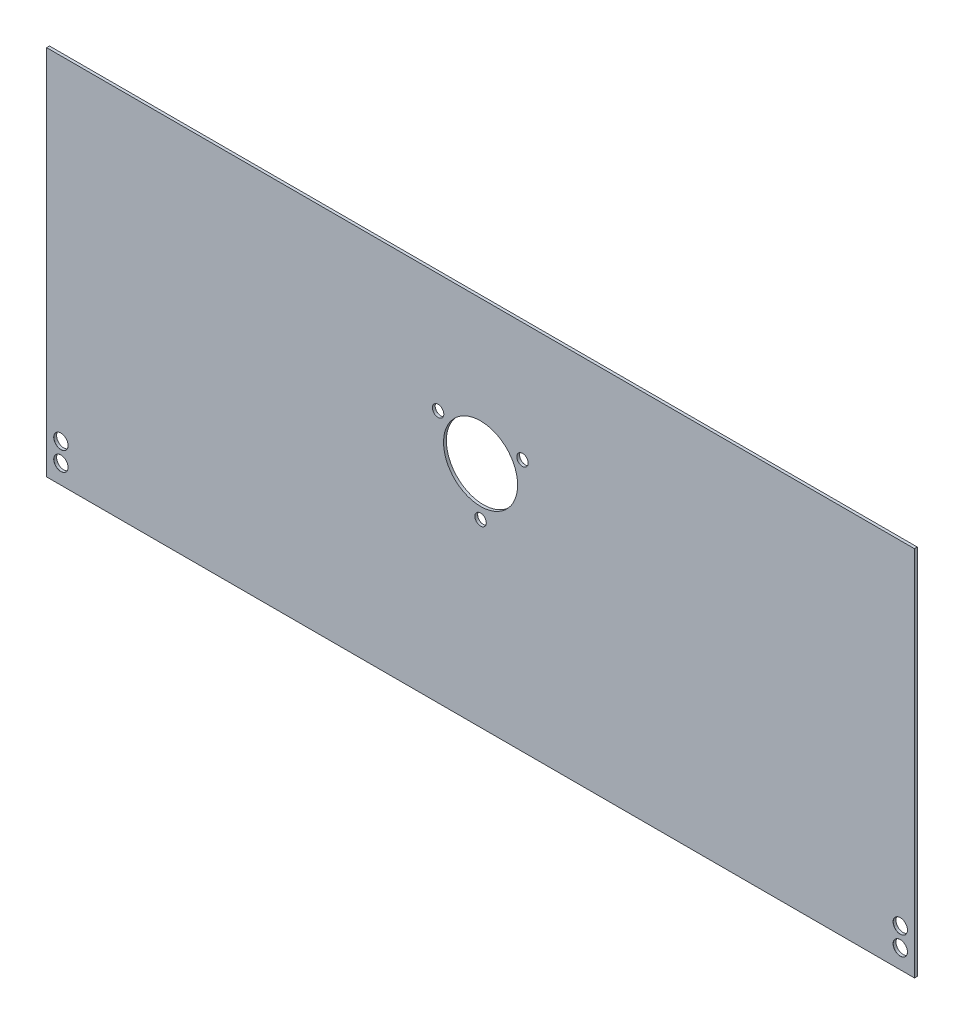
ISO-10303-21;
HEADER;
FILE_DESCRIPTION(('STEP AP214'),'2;1');
FILE_NAME('part.step','',(''),(''),'','','');
FILE_SCHEMA(('AUTOMOTIVE_DESIGN { 1 0 10303 214 1 1 1 1 }'));
ENDSEC;
DATA;
#1=APPLICATION_CONTEXT('core data for automotive mechanical design processes');
#2=APPLICATION_PROTOCOL_DEFINITION('international standard','automotive_design',2000,#1);
#3=PRODUCT_CONTEXT('',#1,'mechanical');
#4=PRODUCT('Part','Part','',(#3));
#5=PRODUCT_RELATED_PRODUCT_CATEGORY('part','',(#4));
#6=PRODUCT_DEFINITION_FORMATION('','',#4);
#7=PRODUCT_DEFINITION_CONTEXT('part definition',#1,'design');
#8=PRODUCT_DEFINITION('design','',#6,#7);
#9=PRODUCT_DEFINITION_SHAPE('','',#8);
#10=(LENGTH_UNIT() NAMED_UNIT(*) SI_UNIT(.MILLI.,.METRE.));
#11=(NAMED_UNIT(*) PLANE_ANGLE_UNIT() SI_UNIT($,.RADIAN.));
#12=(NAMED_UNIT(*) SI_UNIT($,.STERADIAN.) SOLID_ANGLE_UNIT());
#13=UNCERTAINTY_MEASURE_WITH_UNIT(LENGTH_MEASURE(1.E-05),#10,'distance_accuracy_value','');
#14=(GEOMETRIC_REPRESENTATION_CONTEXT(3) GLOBAL_UNCERTAINTY_ASSIGNED_CONTEXT((#13)) GLOBAL_UNIT_ASSIGNED_CONTEXT((#10,
#11,#12)) REPRESENTATION_CONTEXT('',''));
#15=CARTESIAN_POINT('',(0.,0.,0.));
#16=DIRECTION('',(0.,0.,1.));
#17=DIRECTION('',(1.,0.,0.));
#18=AXIS2_PLACEMENT_3D('',#15,#16,#17);
#19=CARTESIAN_POINT('',(0.,0.,0.));
#20=DIRECTION('',(0.,0.,1.));
#21=DIRECTION('',(1.,0.,0.));
#22=AXIS2_PLACEMENT_3D('',#19,#20,#21);
#23=PLANE('',#22);
#24=CARTESIAN_POINT('',(0.,0.,0.));
#25=DIRECTION('',(0.,0.,-1.));
#26=DIRECTION('',(-1.,0.,0.));
#27=AXIS2_PLACEMENT_3D('',#24,#25,#26);
#28=CIRCLE('',#27,13.01);
#29=CARTESIAN_POINT('',(-13.01,0.,0.));
#30=VERTEX_POINT('',#29);
#31=EDGE_CURVE('E100',#30,#30,#28,.T.);
#32=ORIENTED_EDGE('',*,*,#31,.F.);
#33=EDGE_LOOP('',(#32));
#34=FACE_BOUND('',#33,.T.);
#35=CARTESIAN_POINT('',(-14.9188108597104,8.58797314742358,0.));
#36=DIRECTION('',(0.,0.,-1.));
#37=DIRECTION('',(-1.,0.,0.));
#38=AXIS2_PLACEMENT_3D('',#35,#36,#37);
#39=CIRCLE('',#38,2.025);
#40=CARTESIAN_POINT('',(-16.9438108597104,8.58797314742358,0.));
#41=VERTEX_POINT('',#40);
#42=EDGE_CURVE('E111',#41,#41,#39,.T.);
#43=ORIENTED_EDGE('',*,*,#42,.F.);
#44=EDGE_LOOP('',(#43));
#45=FACE_BOUND('',#44,.T.);
#46=CARTESIAN_POINT('',(14.7224318643354,8.50000000000008,0.));
#47=DIRECTION('',(0.,0.,-1.));
#48=DIRECTION('',(-1.,0.,0.));
#49=AXIS2_PLACEMENT_3D('',#46,#47,#48);
#50=CIRCLE('',#49,2.025);
#51=CARTESIAN_POINT('',(12.6974318643354,8.50000000000008,0.));
#52=VERTEX_POINT('',#51);
#53=EDGE_CURVE('E120',#52,#52,#50,.T.);
#54=ORIENTED_EDGE('',*,*,#53,.F.);
#55=EDGE_LOOP('',(#54));
#56=FACE_BOUND('',#55,.T.);
#57=CARTESIAN_POINT('',(0.,-17.,0.));
#58=DIRECTION('',(0.,0.,-1.));
#59=DIRECTION('',(-1.,0.,0.));
#60=AXIS2_PLACEMENT_3D('',#57,#58,#59);
#61=CIRCLE('',#60,2.025);
#62=CARTESIAN_POINT('',(-2.025,-17.,0.));
#63=VERTEX_POINT('',#62);
#64=EDGE_CURVE('E129',#63,#63,#61,.T.);
#65=ORIENTED_EDGE('',*,*,#64,.F.);
#66=EDGE_LOOP('',(#65));
#67=FACE_BOUND('',#66,.T.);
#68=CARTESIAN_POINT('',(-147.4,-73.5833333333333,0.));
#69=DIRECTION('',(0.,0.,1.));
#70=DIRECTION('',(1.,0.,0.));
#71=AXIS2_PLACEMENT_3D('',#68,#69,#70);
#72=CIRCLE('',#71,2.49999999999999);
#73=CARTESIAN_POINT('',(-144.9,-73.5833333333333,0.));
#74=VERTEX_POINT('',#73);
#75=EDGE_CURVE('E148',#74,#74,#72,.F.);
#76=ORIENTED_EDGE('',*,*,#75,.F.);
#77=EDGE_LOOP('',(#76));
#78=FACE_BOUND('',#77,.T.);
#79=CARTESIAN_POINT('',(147.4,-66.9166666666667,0.));
#80=DIRECTION('',(0.,0.,1.));
#81=DIRECTION('',(1.,0.,0.));
#82=AXIS2_PLACEMENT_3D('',#79,#80,#81);
#83=CIRCLE('',#82,2.49999999999999);
#84=CARTESIAN_POINT('',(149.9,-66.9166666666667,0.));
#85=VERTEX_POINT('',#84);
#86=EDGE_CURVE('E157',#85,#85,#83,.F.);
#87=ORIENTED_EDGE('',*,*,#86,.F.);
#88=EDGE_LOOP('',(#87));
#89=FACE_BOUND('',#88,.T.);
#90=DIRECTION('',(0.,1.,0.));
#91=VECTOR('',#90,1.);
#92=CARTESIAN_POINT('',(-152.4,0.,0.));
#93=LINE('',#92,#91);
#94=CARTESIAN_POINT('',(-152.4,-80.25,0.));
#95=VERTEX_POINT('',#94);
#96=CARTESIAN_POINT('',(-152.4,50.3342318891588,0.));
#97=VERTEX_POINT('',#96);
#98=EDGE_CURVE('E91',#95,#97,#93,.T.);
#99=ORIENTED_EDGE('',*,*,#98,.T.);
#100=DIRECTION('',(-1.,0.,0.));
#101=VECTOR('',#100,1.);
#102=CARTESIAN_POINT('',(0.,50.3342318891588,0.));
#103=LINE('',#102,#101);
#104=CARTESIAN_POINT('',(152.4,50.3342318891588,0.));
#105=VERTEX_POINT('',#104);
#106=EDGE_CURVE('E97',#105,#97,#103,.T.);
#107=ORIENTED_EDGE('',*,*,#106,.F.);
#108=DIRECTION('',(0.,1.,0.));
#109=VECTOR('',#108,1.);
#110=CARTESIAN_POINT('',(152.4,0.,0.));
#111=LINE('',#110,#109);
#112=CARTESIAN_POINT('',(152.4,-80.2499999999999,0.));
#113=VERTEX_POINT('',#112);
#114=EDGE_CURVE('E70',#113,#105,#111,.T.);
#115=ORIENTED_EDGE('',*,*,#114,.F.);
#116=DIRECTION('',(1.,0.,0.));
#117=VECTOR('',#116,1.);
#118=CARTESIAN_POINT('',(0.,-80.25,0.));
#119=LINE('',#118,#117);
#120=EDGE_CURVE('E92',#95,#113,#119,.T.);
#121=ORIENTED_EDGE('',*,*,#120,.F.);
#122=EDGE_LOOP('',(#99,#107,#115,#121));
#123=FACE_BOUND('',#122,.T.);
#124=CARTESIAN_POINT('',(147.4,-73.5833333333333,0.));
#125=DIRECTION('',(0.,0.,1.));
#126=DIRECTION('',(1.,0.,0.));
#127=AXIS2_PLACEMENT_3D('',#124,#125,#126);
#128=CIRCLE('',#127,2.49999999999999);
#129=CARTESIAN_POINT('',(149.9,-73.5833333333333,0.));
#130=VERTEX_POINT('',#129);
#131=EDGE_CURVE('E166',#130,#130,#128,.F.);
#132=ORIENTED_EDGE('',*,*,#131,.F.);
#133=EDGE_LOOP('',(#132));
#134=FACE_BOUND('',#133,.T.);
#135=CARTESIAN_POINT('',(-147.4,-66.9166666666667,0.));
#136=DIRECTION('',(0.,0.,1.));
#137=DIRECTION('',(1.,0.,0.));
#138=AXIS2_PLACEMENT_3D('',#135,#136,#137);
#139=CIRCLE('',#138,2.49999999999999);
#140=CARTESIAN_POINT('',(-144.9,-66.9166666666667,0.));
#141=VERTEX_POINT('',#140);
#142=EDGE_CURVE('E139',#141,#141,#139,.F.);
#143=ORIENTED_EDGE('',*,*,#142,.F.);
#144=EDGE_LOOP('',(#143));
#145=FACE_BOUND('',#144,.T.);
#146=ADVANCED_FACE('F41',(#34,#45,#56,#67,#78,#89,#123,#134,#145),#23,.F.);
#147=CARTESIAN_POINT('',(0.,-80.25,1.));
#148=DIRECTION('',(0.,1.,0.));
#149=DIRECTION('',(-1.,0.,0.));
#150=AXIS2_PLACEMENT_3D('',#147,#148,#149);
#151=PLANE('',#150);
#152=ORIENTED_EDGE('',*,*,#120,.T.);
#153=DIRECTION('',(0.,0.,-1.));
#154=VECTOR('',#153,1.);
#155=CARTESIAN_POINT('',(152.4,-80.2499999999999,1.));
#156=LINE('',#155,#154);
#157=CARTESIAN_POINT('',(152.4,-80.2499999999999,1.));
#158=VERTEX_POINT('',#157);
#159=EDGE_CURVE('E11',#158,#113,#156,.T.);
#160=ORIENTED_EDGE('',*,*,#159,.F.);
#161=DIRECTION('',(1.,0.,0.));
#162=VECTOR('',#161,1.);
#163=CARTESIAN_POINT('',(0.,-80.25,1.));
#164=LINE('',#163,#162);
#165=CARTESIAN_POINT('',(-152.4,-80.25,1.));
#166=VERTEX_POINT('',#165);
#167=EDGE_CURVE('E174',#166,#158,#164,.T.);
#168=ORIENTED_EDGE('',*,*,#167,.F.);
#169=DIRECTION('',(0.,0.,-1.));
#170=VECTOR('',#169,1.);
#171=CARTESIAN_POINT('',(-152.4,-80.25,1.));
#172=LINE('',#171,#170);
#173=EDGE_CURVE('E51',#166,#95,#172,.T.);
#174=ORIENTED_EDGE('',*,*,#173,.T.);
#175=EDGE_LOOP('',(#152,#160,#168,#174));
#176=FACE_BOUND('',#175,.T.);
#177=ADVANCED_FACE('F43',(#176),#151,.F.);
#178=CARTESIAN_POINT('',(152.4,0.,1.));
#179=DIRECTION('',(-1.,0.,0.));
#180=DIRECTION('',(0.,0.,1.));
#181=AXIS2_PLACEMENT_3D('',#178,#179,#180);
#182=PLANE('',#181);
#183=ORIENTED_EDGE('',*,*,#114,.T.);
#184=DIRECTION('',(0.,0.,-1.));
#185=VECTOR('',#184,1.);
#186=CARTESIAN_POINT('',(152.4,50.3342318891588,1.));
#187=LINE('',#186,#185);
#188=CARTESIAN_POINT('',(152.4,50.3342318891588,1.));
#189=VERTEX_POINT('',#188);
#190=EDGE_CURVE('E87',#189,#105,#187,.T.);
#191=ORIENTED_EDGE('',*,*,#190,.F.);
#192=DIRECTION('',(0.,1.,0.));
#193=VECTOR('',#192,1.);
#194=CARTESIAN_POINT('',(152.4,0.,1.));
#195=LINE('',#194,#193);
#196=EDGE_CURVE('E77',#158,#189,#195,.T.);
#197=ORIENTED_EDGE('',*,*,#196,.F.);
#198=ORIENTED_EDGE('',*,*,#159,.T.);
#199=EDGE_LOOP('',(#183,#191,#197,#198));
#200=FACE_BOUND('',#199,.T.);
#201=ADVANCED_FACE('F86',(#200),#182,.F.);
#202=CARTESIAN_POINT('',(-152.4,0.,1.));
#203=DIRECTION('',(-1.,0.,0.));
#204=DIRECTION('',(0.,0.,1.));
#205=AXIS2_PLACEMENT_3D('',#202,#203,#204);
#206=PLANE('',#205);
#207=ORIENTED_EDGE('',*,*,#98,.F.);
#208=ORIENTED_EDGE('',*,*,#173,.F.);
#209=DIRECTION('',(0.,1.,0.));
#210=VECTOR('',#209,1.);
#211=CARTESIAN_POINT('',(-152.4,0.,1.));
#212=LINE('',#211,#210);
#213=CARTESIAN_POINT('',(-152.4,50.3342318891588,1.));
#214=VERTEX_POINT('',#213);
#215=EDGE_CURVE('E177',#166,#214,#212,.T.);
#216=ORIENTED_EDGE('',*,*,#215,.T.);
#217=DIRECTION('',(0.,0.,-1.));
#218=VECTOR('',#217,1.);
#219=CARTESIAN_POINT('',(-152.4,50.3342318891588,1.));
#220=LINE('',#219,#218);
#221=EDGE_CURVE('E101',#214,#97,#220,.T.);
#222=ORIENTED_EDGE('',*,*,#221,.T.);
#223=EDGE_LOOP('',(#207,#208,#216,#222));
#224=FACE_BOUND('',#223,.T.);
#225=ADVANCED_FACE('F183',(#224),#206,.T.);
#226=CARTESIAN_POINT('',(0.,0.,1.));
#227=DIRECTION('',(0.,0.,1.));
#228=DIRECTION('',(1.,0.,0.));
#229=AXIS2_PLACEMENT_3D('',#226,#227,#228);
#230=PLANE('',#229);
#231=ORIENTED_EDGE('',*,*,#196,.T.);
#232=DIRECTION('',(-1.,0.,0.));
#233=VECTOR('',#232,1.);
#234=CARTESIAN_POINT('',(0.,50.3342318891588,1.));
#235=LINE('',#234,#233);
#236=EDGE_CURVE('E99',#189,#214,#235,.T.);
#237=ORIENTED_EDGE('',*,*,#236,.T.);
#238=ORIENTED_EDGE('',*,*,#215,.F.);
#239=ORIENTED_EDGE('',*,*,#167,.T.);
#240=EDGE_LOOP('',(#231,#237,#238,#239));
#241=FACE_BOUND('',#240,.T.);
#242=CARTESIAN_POINT('',(0.,0.,0.999999999999999));
#243=DIRECTION('',(0.,0.,1.));
#244=DIRECTION('',(1.,0.,0.));
#245=AXIS2_PLACEMENT_3D('',#242,#243,#244);
#246=CIRCLE('',#245,13.01);
#247=CARTESIAN_POINT('',(13.01,0.,0.999999999999999));
#248=VERTEX_POINT('',#247);
#249=EDGE_CURVE('E45',#248,#248,#246,.T.);
#250=ORIENTED_EDGE('',*,*,#249,.F.);
#251=EDGE_LOOP('',(#250));
#252=FACE_BOUND('',#251,.T.);
#253=CARTESIAN_POINT('',(-14.9188108597104,8.58797314742358,1.));
#254=DIRECTION('',(0.,0.,-1.));
#255=DIRECTION('',(-1.,0.,0.));
#256=AXIS2_PLACEMENT_3D('',#253,#254,#255);
#257=CIRCLE('',#256,2.);
#258=CARTESIAN_POINT('',(-16.9188108597104,8.58797314742358,1.));
#259=VERTEX_POINT('',#258);
#260=EDGE_CURVE('E117',#259,#259,#257,.T.);
#261=ORIENTED_EDGE('',*,*,#260,.T.);
#262=EDGE_LOOP('',(#261));
#263=FACE_BOUND('',#262,.T.);
#264=CARTESIAN_POINT('',(14.7224318643354,8.50000000000008,1.));
#265=DIRECTION('',(0.,0.,-1.));
#266=DIRECTION('',(-1.,0.,0.));
#267=AXIS2_PLACEMENT_3D('',#264,#265,#266);
#268=CIRCLE('',#267,2.);
#269=CARTESIAN_POINT('',(12.7224318643354,8.50000000000008,1.));
#270=VERTEX_POINT('',#269);
#271=EDGE_CURVE('E126',#270,#270,#268,.T.);
#272=ORIENTED_EDGE('',*,*,#271,.T.);
#273=EDGE_LOOP('',(#272));
#274=FACE_BOUND('',#273,.T.);
#275=CARTESIAN_POINT('',(0.,-17.,1.));
#276=DIRECTION('',(0.,0.,-1.));
#277=DIRECTION('',(-1.,0.,0.));
#278=AXIS2_PLACEMENT_3D('',#275,#276,#277);
#279=CIRCLE('',#278,2.);
#280=CARTESIAN_POINT('',(-2.,-17.,1.));
#281=VERTEX_POINT('',#280);
#282=EDGE_CURVE('E135',#281,#281,#279,.T.);
#283=ORIENTED_EDGE('',*,*,#282,.T.);
#284=EDGE_LOOP('',(#283));
#285=FACE_BOUND('',#284,.T.);
#286=CARTESIAN_POINT('',(-147.4,-66.9166666666667,1.));
#287=DIRECTION('',(0.,0.,1.));
#288=DIRECTION('',(1.,0.,0.));
#289=AXIS2_PLACEMENT_3D('',#286,#287,#288);
#290=CIRCLE('',#289,2.525);
#291=CARTESIAN_POINT('',(-144.875,-66.9166666666667,1.));
#292=VERTEX_POINT('',#291);
#293=EDGE_CURVE('E138',#292,#292,#290,.T.);
#294=ORIENTED_EDGE('',*,*,#293,.F.);
#295=EDGE_LOOP('',(#294));
#296=FACE_BOUND('',#295,.T.);
#297=CARTESIAN_POINT('',(-147.4,-73.5833333333333,1.));
#298=DIRECTION('',(0.,0.,1.));
#299=DIRECTION('',(1.,0.,0.));
#300=AXIS2_PLACEMENT_3D('',#297,#298,#299);
#301=CIRCLE('',#300,2.525);
#302=CARTESIAN_POINT('',(-144.875,-73.5833333333333,1.));
#303=VERTEX_POINT('',#302);
#304=EDGE_CURVE('E142',#303,#303,#301,.T.);
#305=ORIENTED_EDGE('',*,*,#304,.F.);
#306=EDGE_LOOP('',(#305));
#307=FACE_BOUND('',#306,.T.);
#308=CARTESIAN_POINT('',(147.4,-66.9166666666667,1.));
#309=DIRECTION('',(0.,0.,1.));
#310=DIRECTION('',(1.,0.,0.));
#311=AXIS2_PLACEMENT_3D('',#308,#309,#310);
#312=CIRCLE('',#311,2.525);
#313=CARTESIAN_POINT('',(149.925,-66.9166666666667,1.));
#314=VERTEX_POINT('',#313);
#315=EDGE_CURVE('E151',#314,#314,#312,.T.);
#316=ORIENTED_EDGE('',*,*,#315,.F.);
#317=EDGE_LOOP('',(#316));
#318=FACE_BOUND('',#317,.T.);
#319=CARTESIAN_POINT('',(147.4,-73.5833333333333,1.));
#320=DIRECTION('',(0.,0.,1.));
#321=DIRECTION('',(1.,0.,0.));
#322=AXIS2_PLACEMENT_3D('',#319,#320,#321);
#323=CIRCLE('',#322,2.525);
#324=CARTESIAN_POINT('',(149.925,-73.5833333333333,1.));
#325=VERTEX_POINT('',#324);
#326=EDGE_CURVE('E160',#325,#325,#323,.T.);
#327=ORIENTED_EDGE('',*,*,#326,.F.);
#328=EDGE_LOOP('',(#327));
#329=FACE_BOUND('',#328,.T.);
#330=ADVANCED_FACE('F184',(#241,#252,#263,#274,#285,#296,#307,#318,#329),#230,.T.);
#331=CARTESIAN_POINT('',(147.4,-73.5833333333333,1.));
#332=DIRECTION('',(0.,0.,1.));
#333=DIRECTION('',(1.,0.,0.));
#334=AXIS2_PLACEMENT_3D('',#331,#332,#333);
#335=CYLINDRICAL_SURFACE('',#334,2.49999999999999);
#336=ORIENTED_EDGE('',*,*,#131,.T.);
#337=EDGE_LOOP('',(#336));
#338=FACE_BOUND('',#337,.T.);
#339=CARTESIAN_POINT('',(147.4,-73.5833333333333,0.974999999999989));
#340=DIRECTION('',(0.,0.,1.));
#341=DIRECTION('',(1.,0.,0.));
#342=AXIS2_PLACEMENT_3D('',#339,#340,#341);
#343=CIRCLE('',#342,2.5);
#344=CARTESIAN_POINT('',(149.9,-73.5833333333333,0.974999999999989));
#345=VERTEX_POINT('',#344);
#346=EDGE_CURVE('E169',#345,#345,#343,.T.);
#347=ORIENTED_EDGE('',*,*,#346,.T.);
#348=EDGE_LOOP('',(#347));
#349=FACE_BOUND('',#348,.T.);
#350=ADVANCED_FACE('F187',(#338,#349),#335,.F.);
#351=CARTESIAN_POINT('',(147.4,-73.5833333333333,1.));
#352=DIRECTION('',(0.,0.,1.));
#353=DIRECTION('',(1.,0.,0.));
#354=AXIS2_PLACEMENT_3D('',#351,#352,#353);
#355=CONICAL_SURFACE('',#354,2.525,0.785398163397136);
#356=ORIENTED_EDGE('',*,*,#346,.F.);
#357=EDGE_LOOP('',(#356));
#358=FACE_BOUND('',#357,.T.);
#359=ORIENTED_EDGE('',*,*,#326,.T.);
#360=EDGE_LOOP('',(#359));
#361=FACE_BOUND('',#360,.T.);
#362=ADVANCED_FACE('F206',(#358,#361),#355,.F.);
#363=CARTESIAN_POINT('',(147.4,-66.9166666666667,1.));
#364=DIRECTION('',(0.,0.,1.));
#365=DIRECTION('',(1.,0.,0.));
#366=AXIS2_PLACEMENT_3D('',#363,#364,#365);
#367=CYLINDRICAL_SURFACE('',#366,2.49999999999999);
#368=ORIENTED_EDGE('',*,*,#86,.T.);
#369=EDGE_LOOP('',(#368));
#370=FACE_BOUND('',#369,.T.);
#371=CARTESIAN_POINT('',(147.4,-66.9166666666667,0.974999999999989));
#372=DIRECTION('',(0.,0.,1.));
#373=DIRECTION('',(1.,0.,0.));
#374=AXIS2_PLACEMENT_3D('',#371,#372,#373);
#375=CIRCLE('',#374,2.5);
#376=CARTESIAN_POINT('',(149.9,-66.9166666666667,0.974999999999989));
#377=VERTEX_POINT('',#376);
#378=EDGE_CURVE('E161',#377,#377,#375,.T.);
#379=ORIENTED_EDGE('',*,*,#378,.T.);
#380=EDGE_LOOP('',(#379));
#381=FACE_BOUND('',#380,.T.);
#382=ADVANCED_FACE('F208',(#370,#381),#367,.F.);
#383=CARTESIAN_POINT('',(147.4,-66.9166666666667,1.));
#384=DIRECTION('',(0.,0.,1.));
#385=DIRECTION('',(1.,0.,0.));
#386=AXIS2_PLACEMENT_3D('',#383,#384,#385);
#387=CONICAL_SURFACE('',#386,2.525,0.785398163397136);
#388=ORIENTED_EDGE('',*,*,#378,.F.);
#389=EDGE_LOOP('',(#388));
#390=FACE_BOUND('',#389,.T.);
#391=ORIENTED_EDGE('',*,*,#315,.T.);
#392=EDGE_LOOP('',(#391));
#393=FACE_BOUND('',#392,.T.);
#394=ADVANCED_FACE('F215',(#390,#393),#387,.F.);
#395=CARTESIAN_POINT('',(-147.4,-73.5833333333333,1.));
#396=DIRECTION('',(0.,0.,1.));
#397=DIRECTION('',(1.,0.,0.));
#398=AXIS2_PLACEMENT_3D('',#395,#396,#397);
#399=CYLINDRICAL_SURFACE('',#398,2.49999999999999);
#400=ORIENTED_EDGE('',*,*,#75,.T.);
#401=EDGE_LOOP('',(#400));
#402=FACE_BOUND('',#401,.T.);
#403=CARTESIAN_POINT('',(-147.4,-73.5833333333333,0.974999999999989));
#404=DIRECTION('',(0.,0.,1.));
#405=DIRECTION('',(1.,0.,0.));
#406=AXIS2_PLACEMENT_3D('',#403,#404,#405);
#407=CIRCLE('',#406,2.5);
#408=CARTESIAN_POINT('',(-144.9,-73.5833333333333,0.974999999999989));
#409=VERTEX_POINT('',#408);
#410=EDGE_CURVE('E152',#409,#409,#407,.T.);
#411=ORIENTED_EDGE('',*,*,#410,.T.);
#412=EDGE_LOOP('',(#411));
#413=FACE_BOUND('',#412,.T.);
#414=ADVANCED_FACE('F274',(#402,#413),#399,.F.);
#415=CARTESIAN_POINT('',(-147.4,-73.5833333333333,1.));
#416=DIRECTION('',(0.,0.,1.));
#417=DIRECTION('',(1.,0.,0.));
#418=AXIS2_PLACEMENT_3D('',#415,#416,#417);
#419=CONICAL_SURFACE('',#418,2.525,0.785398163397136);
#420=ORIENTED_EDGE('',*,*,#410,.F.);
#421=EDGE_LOOP('',(#420));
#422=FACE_BOUND('',#421,.T.);
#423=ORIENTED_EDGE('',*,*,#304,.T.);
#424=EDGE_LOOP('',(#423));
#425=FACE_BOUND('',#424,.T.);
#426=ADVANCED_FACE('F285',(#422,#425),#419,.F.);
#427=CARTESIAN_POINT('',(-147.4,-66.9166666666667,1.));
#428=DIRECTION('',(0.,0.,1.));
#429=DIRECTION('',(1.,0.,0.));
#430=AXIS2_PLACEMENT_3D('',#427,#428,#429);
#431=CYLINDRICAL_SURFACE('',#430,2.49999999999999);
#432=ORIENTED_EDGE('',*,*,#142,.T.);
#433=EDGE_LOOP('',(#432));
#434=FACE_BOUND('',#433,.T.);
#435=CARTESIAN_POINT('',(-147.4,-66.9166666666667,0.974999999999989));
#436=DIRECTION('',(0.,0.,1.));
#437=DIRECTION('',(1.,0.,0.));
#438=AXIS2_PLACEMENT_3D('',#435,#436,#437);
#439=CIRCLE('',#438,2.5);
#440=CARTESIAN_POINT('',(-144.9,-66.9166666666667,0.974999999999989));
#441=VERTEX_POINT('',#440);
#442=EDGE_CURVE('E143',#441,#441,#439,.T.);
#443=ORIENTED_EDGE('',*,*,#442,.T.);
#444=EDGE_LOOP('',(#443));
#445=FACE_BOUND('',#444,.T.);
#446=ADVANCED_FACE('F296',(#434,#445),#431,.F.);
#447=CARTESIAN_POINT('',(-147.4,-66.9166666666667,1.));
#448=DIRECTION('',(0.,0.,1.));
#449=DIRECTION('',(1.,0.,0.));
#450=AXIS2_PLACEMENT_3D('',#447,#448,#449);
#451=CONICAL_SURFACE('',#450,2.525,0.785398163397136);
#452=ORIENTED_EDGE('',*,*,#442,.F.);
#453=EDGE_LOOP('',(#452));
#454=FACE_BOUND('',#453,.T.);
#455=ORIENTED_EDGE('',*,*,#293,.T.);
#456=EDGE_LOOP('',(#455));
#457=FACE_BOUND('',#456,.T.);
#458=ADVANCED_FACE('F307',(#454,#457),#451,.F.);
#459=CARTESIAN_POINT('',(0.,-17.,0.));
#460=DIRECTION('',(0.,0.,-1.));
#461=DIRECTION('',(-1.,0.,0.));
#462=AXIS2_PLACEMENT_3D('',#459,#460,#461);
#463=CYLINDRICAL_SURFACE('',#462,2.);
#464=ORIENTED_EDGE('',*,*,#282,.F.);
#465=EDGE_LOOP('',(#464));
#466=FACE_BOUND('',#465,.T.);
#467=CARTESIAN_POINT('',(0.,-17.,0.0250000000000009));
#468=DIRECTION('',(0.,0.,-1.));
#469=DIRECTION('',(-1.,0.,0.));
#470=AXIS2_PLACEMENT_3D('',#467,#468,#469);
#471=CIRCLE('',#470,2.);
#472=CARTESIAN_POINT('',(-2.,-17.,0.0250000000000009));
#473=VERTEX_POINT('',#472);
#474=EDGE_CURVE('E132',#473,#473,#471,.T.);
#475=ORIENTED_EDGE('',*,*,#474,.T.);
#476=EDGE_LOOP('',(#475));
#477=FACE_BOUND('',#476,.T.);
#478=ADVANCED_FACE('F318',(#466,#477),#463,.F.);
#479=CARTESIAN_POINT('',(0.,-17.,0.));
#480=DIRECTION('',(0.,0.,-1.));
#481=DIRECTION('',(-1.,0.,0.));
#482=AXIS2_PLACEMENT_3D('',#479,#480,#481);
#483=CONICAL_SURFACE('',#482,2.025,0.785398163397427);
#484=ORIENTED_EDGE('',*,*,#474,.F.);
#485=EDGE_LOOP('',(#484));
#486=FACE_BOUND('',#485,.T.);
#487=ORIENTED_EDGE('',*,*,#64,.T.);
#488=EDGE_LOOP('',(#487));
#489=FACE_BOUND('',#488,.T.);
#490=ADVANCED_FACE('F329',(#486,#489),#483,.F.);
#491=CARTESIAN_POINT('',(14.7224318643354,8.50000000000008,0.));
#492=DIRECTION('',(0.,0.,-1.));
#493=DIRECTION('',(-1.,0.,0.));
#494=AXIS2_PLACEMENT_3D('',#491,#492,#493);
#495=CYLINDRICAL_SURFACE('',#494,2.);
#496=ORIENTED_EDGE('',*,*,#271,.F.);
#497=EDGE_LOOP('',(#496));
#498=FACE_BOUND('',#497,.T.);
#499=CARTESIAN_POINT('',(14.7224318643354,8.50000000000008,0.0250000000000009));
#500=DIRECTION('',(0.,0.,-1.));
#501=DIRECTION('',(-1.,0.,0.));
#502=AXIS2_PLACEMENT_3D('',#499,#500,#501);
#503=CIRCLE('',#502,2.);
#504=CARTESIAN_POINT('',(12.7224318643354,8.50000000000008,0.0250000000000009));
#505=VERTEX_POINT('',#504);
#506=EDGE_CURVE('E123',#505,#505,#503,.T.);
#507=ORIENTED_EDGE('',*,*,#506,.T.);
#508=EDGE_LOOP('',(#507));
#509=FACE_BOUND('',#508,.T.);
#510=ADVANCED_FACE('F340',(#498,#509),#495,.F.);
#511=CARTESIAN_POINT('',(14.7224318643354,8.50000000000008,0.));
#512=DIRECTION('',(0.,0.,-1.));
#513=DIRECTION('',(-1.,0.,0.));
#514=AXIS2_PLACEMENT_3D('',#511,#512,#513);
#515=CONICAL_SURFACE('',#514,2.025,0.785398163397375);
#516=ORIENTED_EDGE('',*,*,#506,.F.);
#517=EDGE_LOOP('',(#516));
#518=FACE_BOUND('',#517,.T.);
#519=ORIENTED_EDGE('',*,*,#53,.T.);
#520=EDGE_LOOP('',(#519));
#521=FACE_BOUND('',#520,.T.);
#522=ADVANCED_FACE('F351',(#518,#521),#515,.F.);
#523=CARTESIAN_POINT('',(-14.9188108597104,8.58797314742358,0.));
#524=DIRECTION('',(0.,0.,-1.));
#525=DIRECTION('',(-1.,0.,0.));
#526=AXIS2_PLACEMENT_3D('',#523,#524,#525);
#527=CYLINDRICAL_SURFACE('',#526,2.);
#528=ORIENTED_EDGE('',*,*,#260,.F.);
#529=EDGE_LOOP('',(#528));
#530=FACE_BOUND('',#529,.T.);
#531=CARTESIAN_POINT('',(-14.9188108597104,8.58797314742358,0.0250000000000009));
#532=DIRECTION('',(0.,0.,-1.));
#533=DIRECTION('',(-1.,0.,0.));
#534=AXIS2_PLACEMENT_3D('',#531,#532,#533);
#535=CIRCLE('',#534,2.);
#536=CARTESIAN_POINT('',(-16.9188108597104,8.58797314742358,0.0250000000000009));
#537=VERTEX_POINT('',#536);
#538=EDGE_CURVE('E114',#537,#537,#535,.T.);
#539=ORIENTED_EDGE('',*,*,#538,.T.);
#540=EDGE_LOOP('',(#539));
#541=FACE_BOUND('',#540,.T.);
#542=ADVANCED_FACE('F362',(#530,#541),#527,.F.);
#543=CARTESIAN_POINT('',(-14.9188108597104,8.58797314742358,0.));
#544=DIRECTION('',(0.,0.,-1.));
#545=DIRECTION('',(-1.,0.,0.));
#546=AXIS2_PLACEMENT_3D('',#543,#544,#545);
#547=CONICAL_SURFACE('',#546,2.025,0.785398163397409);
#548=ORIENTED_EDGE('',*,*,#538,.F.);
#549=EDGE_LOOP('',(#548));
#550=FACE_BOUND('',#549,.T.);
#551=ORIENTED_EDGE('',*,*,#42,.T.);
#552=EDGE_LOOP('',(#551));
#553=FACE_BOUND('',#552,.T.);
#554=ADVANCED_FACE('F373',(#550,#553),#547,.F.);
#555=CARTESIAN_POINT('',(0.,0.,10.));
#556=DIRECTION('',(0.,0.,-1.));
#557=DIRECTION('',(-1.,0.,0.));
#558=AXIS2_PLACEMENT_3D('',#555,#556,#557);
#559=CYLINDRICAL_SURFACE('',#558,13.01);
#560=ORIENTED_EDGE('',*,*,#249,.T.);
#561=EDGE_LOOP('',(#560));
#562=FACE_BOUND('',#561,.T.);
#563=ORIENTED_EDGE('',*,*,#31,.T.);
#564=EDGE_LOOP('',(#563));
#565=FACE_BOUND('',#564,.T.);
#566=ADVANCED_FACE('F384',(#562,#565),#559,.F.);
#567=CARTESIAN_POINT('',(0.,50.3342318891588,1.));
#568=DIRECTION('',(0.,-1.,0.));
#569=DIRECTION('',(0.,0.,-1.));
#570=AXIS2_PLACEMENT_3D('',#567,#568,#569);
#571=PLANE('',#570);
#572=ORIENTED_EDGE('',*,*,#106,.T.);
#573=ORIENTED_EDGE('',*,*,#221,.F.);
#574=ORIENTED_EDGE('',*,*,#236,.F.);
#575=ORIENTED_EDGE('',*,*,#190,.T.);
#576=EDGE_LOOP('',(#572,#573,#574,#575));
#577=FACE_BOUND('',#576,.T.);
#578=ADVANCED_FACE('F95',(#577),#571,.F.);
#579=CLOSED_SHELL('',(#146,#177,#201,#225,#330,#350,#362,#382,#394,#414,#426,#446,#458,#478,
#490,#510,#522,#542,#554,#566,#578));
#580=MANIFOLD_SOLID_BREP('B2',#579);
#581=ADVANCED_BREP_SHAPE_REPRESENTATION('',(#18,#580),#14);
#582=SHAPE_DEFINITION_REPRESENTATION(#9,#581);
ENDSEC;
END-ISO-10303-21;
